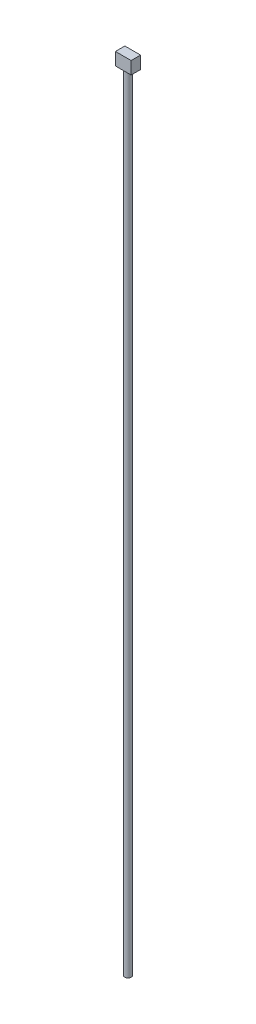
ISO-10303-21;
HEADER;
FILE_DESCRIPTION(('STEP AP214'),'2;1');
FILE_NAME('part.step','',(''),(''),'','','');
FILE_SCHEMA(('AUTOMOTIVE_DESIGN { 1 0 10303 214 1 1 1 1 }'));
ENDSEC;
DATA;
#1=APPLICATION_CONTEXT('core data for automotive mechanical design processes');
#2=APPLICATION_PROTOCOL_DEFINITION('international standard','automotive_design',2000,#1);
#3=PRODUCT_CONTEXT('',#1,'mechanical');
#4=PRODUCT('Part','Part','',(#3));
#5=PRODUCT_RELATED_PRODUCT_CATEGORY('part','',(#4));
#6=PRODUCT_DEFINITION_FORMATION('','',#4);
#7=PRODUCT_DEFINITION_CONTEXT('part definition',#1,'design');
#8=PRODUCT_DEFINITION('design','',#6,#7);
#9=PRODUCT_DEFINITION_SHAPE('','',#8);
#10=(LENGTH_UNIT() NAMED_UNIT(*) SI_UNIT(.MILLI.,.METRE.));
#11=(NAMED_UNIT(*) PLANE_ANGLE_UNIT() SI_UNIT($,.RADIAN.));
#12=(NAMED_UNIT(*) SI_UNIT($,.STERADIAN.) SOLID_ANGLE_UNIT());
#13=UNCERTAINTY_MEASURE_WITH_UNIT(LENGTH_MEASURE(1.E-05),#10,'distance_accuracy_value','');
#14=(GEOMETRIC_REPRESENTATION_CONTEXT(3) GLOBAL_UNCERTAINTY_ASSIGNED_CONTEXT((#13)) GLOBAL_UNIT_ASSIGNED_CONTEXT((#10,
#11,#12)) REPRESENTATION_CONTEXT('',''));
#15=CARTESIAN_POINT('',(0.,0.,0.));
#16=DIRECTION('',(0.,0.,1.));
#17=DIRECTION('',(1.,0.,0.));
#18=AXIS2_PLACEMENT_3D('',#15,#16,#17);
#19=CARTESIAN_POINT('',(0.,125.,0.));
#20=DIRECTION('',(0.,-1.,0.));
#21=DIRECTION('',(0.,0.,-1.));
#22=AXIS2_PLACEMENT_3D('',#19,#20,#21);
#23=CYLINDRICAL_SURFACE('',#22,0.525);
#24=CARTESIAN_POINT('',(0.,125.,0.));
#25=DIRECTION('',(0.,1.,0.));
#26=DIRECTION('',(0.,0.,1.));
#27=AXIS2_PLACEMENT_3D('',#24,#25,#26);
#28=CIRCLE('',#27,0.525);
#29=CARTESIAN_POINT('',(0.,125.,0.525));
#30=VERTEX_POINT('',#29);
#31=EDGE_CURVE('E11',#30,#30,#28,.T.);
#32=ORIENTED_EDGE('',*,*,#31,.F.);
#33=EDGE_LOOP('',(#32));
#34=FACE_BOUND('',#33,.T.);
#35=CARTESIAN_POINT('',(0.,0.,0.));
#36=DIRECTION('',(0.,1.,0.));
#37=DIRECTION('',(0.,0.,1.));
#38=AXIS2_PLACEMENT_3D('',#35,#36,#37);
#39=CIRCLE('',#38,0.525);
#40=CARTESIAN_POINT('',(0.,0.,0.525));
#41=VERTEX_POINT('',#40);
#42=EDGE_CURVE('E44',#41,#41,#39,.T.);
#43=ORIENTED_EDGE('',*,*,#42,.T.);
#44=EDGE_LOOP('',(#43));
#45=FACE_BOUND('',#44,.T.);
#46=ADVANCED_FACE('F41',(#34,#45),#23,.T.);
#47=CARTESIAN_POINT('',(0.,0.,0.));
#48=DIRECTION('',(0.,1.,0.));
#49=DIRECTION('',(0.,0.,1.));
#50=AXIS2_PLACEMENT_3D('',#47,#48,#49);
#51=PLANE('',#50);
#52=ORIENTED_EDGE('',*,*,#42,.F.);
#53=EDGE_LOOP('',(#52));
#54=FACE_BOUND('',#53,.T.);
#55=ADVANCED_FACE('F133',(#54),#51,.F.);
#56=CARTESIAN_POINT('',(1.25,127.,0.75));
#57=DIRECTION('',(-1.,0.,0.));
#58=DIRECTION('',(0.,0.,1.));
#59=AXIS2_PLACEMENT_3D('',#56,#57,#58);
#60=PLANE('',#59);
#61=DIRECTION('',(0.,0.,-1.));
#62=VECTOR('',#61,1.);
#63=CARTESIAN_POINT('',(1.25,125.,0.75));
#64=LINE('',#63,#62);
#65=CARTESIAN_POINT('',(1.25,125.,0.75));
#66=VERTEX_POINT('',#65);
#67=CARTESIAN_POINT('',(1.25,125.,-0.75));
#68=VERTEX_POINT('',#67);
#69=EDGE_CURVE('E113',#66,#68,#64,.T.);
#70=ORIENTED_EDGE('',*,*,#69,.T.);
#71=DIRECTION('',(0.,-1.,0.));
#72=VECTOR('',#71,1.);
#73=CARTESIAN_POINT('',(1.25,127.,-0.75));
#74=LINE('',#73,#72);
#75=CARTESIAN_POINT('',(1.25,127.,-0.75));
#76=VERTEX_POINT('',#75);
#77=EDGE_CURVE('E102',#76,#68,#74,.T.);
#78=ORIENTED_EDGE('',*,*,#77,.F.);
#79=DIRECTION('',(0.,0.,-1.));
#80=VECTOR('',#79,1.);
#81=CARTESIAN_POINT('',(1.25,127.,0.75));
#82=LINE('',#81,#80);
#83=CARTESIAN_POINT('',(1.25,127.,0.75));
#84=VERTEX_POINT('',#83);
#85=EDGE_CURVE('E94',#84,#76,#82,.T.);
#86=ORIENTED_EDGE('',*,*,#85,.F.);
#87=DIRECTION('',(0.,-1.,0.));
#88=VECTOR('',#87,1.);
#89=CARTESIAN_POINT('',(1.25,127.,0.75));
#90=LINE('',#89,#88);
#91=EDGE_CURVE('E109',#84,#66,#90,.T.);
#92=ORIENTED_EDGE('',*,*,#91,.T.);
#93=EDGE_LOOP('',(#70,#78,#86,#92));
#94=FACE_BOUND('',#93,.T.);
#95=ADVANCED_FACE('F135',(#94),#60,.F.);
#96=CARTESIAN_POINT('',(-1.25,127.,-0.75));
#97=DIRECTION('',(0.,0.,1.));
#98=DIRECTION('',(1.,0.,0.));
#99=AXIS2_PLACEMENT_3D('',#96,#97,#98);
#100=PLANE('',#99);
#101=DIRECTION('',(-1.,0.,0.));
#102=VECTOR('',#101,1.);
#103=CARTESIAN_POINT('',(-1.25,125.,-0.75));
#104=LINE('',#103,#102);
#105=CARTESIAN_POINT('',(-1.25,125.,-0.75));
#106=VERTEX_POINT('',#105);
#107=EDGE_CURVE('E100',#68,#106,#104,.T.);
#108=ORIENTED_EDGE('',*,*,#107,.T.);
#109=DIRECTION('',(0.,-1.,0.));
#110=VECTOR('',#109,1.);
#111=CARTESIAN_POINT('',(-1.25,127.,-0.75));
#112=LINE('',#111,#110);
#113=CARTESIAN_POINT('',(-1.25,127.,-0.75));
#114=VERTEX_POINT('',#113);
#115=EDGE_CURVE('E98',#114,#106,#112,.T.);
#116=ORIENTED_EDGE('',*,*,#115,.F.);
#117=DIRECTION('',(-1.,0.,0.));
#118=VECTOR('',#117,1.);
#119=CARTESIAN_POINT('',(-1.25,127.,-0.75));
#120=LINE('',#119,#118);
#121=EDGE_CURVE('E89',#76,#114,#120,.T.);
#122=ORIENTED_EDGE('',*,*,#121,.F.);
#123=ORIENTED_EDGE('',*,*,#77,.T.);
#124=EDGE_LOOP('',(#108,#116,#122,#123));
#125=FACE_BOUND('',#124,.T.);
#126=ADVANCED_FACE('F99',(#125),#100,.F.);
#127=CARTESIAN_POINT('',(-1.25,127.,0.75));
#128=DIRECTION('',(1.,0.,0.));
#129=DIRECTION('',(0.,0.,-1.));
#130=AXIS2_PLACEMENT_3D('',#127,#128,#129);
#131=PLANE('',#130);
#132=DIRECTION('',(0.,0.,1.));
#133=VECTOR('',#132,1.);
#134=CARTESIAN_POINT('',(-1.25,125.,0.75));
#135=LINE('',#134,#133);
#136=CARTESIAN_POINT('',(-1.25,125.,0.75));
#137=VERTEX_POINT('',#136);
#138=EDGE_CURVE('E75',#106,#137,#135,.T.);
#139=ORIENTED_EDGE('',*,*,#138,.T.);
#140=DIRECTION('',(0.,-1.,0.));
#141=VECTOR('',#140,1.);
#142=CARTESIAN_POINT('',(-1.25,127.,0.75));
#143=LINE('',#142,#141);
#144=CARTESIAN_POINT('',(-1.25,127.,0.75));
#145=VERTEX_POINT('',#144);
#146=EDGE_CURVE('E103',#145,#137,#143,.T.);
#147=ORIENTED_EDGE('',*,*,#146,.F.);
#148=DIRECTION('',(0.,0.,1.));
#149=VECTOR('',#148,1.);
#150=CARTESIAN_POINT('',(-1.25,127.,0.75));
#151=LINE('',#150,#149);
#152=EDGE_CURVE('E92',#114,#145,#151,.T.);
#153=ORIENTED_EDGE('',*,*,#152,.F.);
#154=ORIENTED_EDGE('',*,*,#115,.T.);
#155=EDGE_LOOP('',(#139,#147,#153,#154));
#156=FACE_BOUND('',#155,.T.);
#157=ADVANCED_FACE('F105',(#156),#131,.F.);
#158=CARTESIAN_POINT('',(-1.25,127.,0.75));
#159=DIRECTION('',(0.,0.,-1.));
#160=DIRECTION('',(-1.,0.,0.));
#161=AXIS2_PLACEMENT_3D('',#158,#159,#160);
#162=PLANE('',#161);
#163=DIRECTION('',(1.,0.,0.));
#164=VECTOR('',#163,1.);
#165=CARTESIAN_POINT('',(-1.25,125.,0.75));
#166=LINE('',#165,#164);
#167=EDGE_CURVE('E81',#137,#66,#166,.T.);
#168=ORIENTED_EDGE('',*,*,#167,.T.);
#169=ORIENTED_EDGE('',*,*,#91,.F.);
#170=DIRECTION('',(1.,0.,0.));
#171=VECTOR('',#170,1.);
#172=CARTESIAN_POINT('',(-1.25,127.,0.75));
#173=LINE('',#172,#171);
#174=EDGE_CURVE('E58',#145,#84,#173,.T.);
#175=ORIENTED_EDGE('',*,*,#174,.F.);
#176=ORIENTED_EDGE('',*,*,#146,.T.);
#177=EDGE_LOOP('',(#168,#169,#175,#176));
#178=FACE_BOUND('',#177,.T.);
#179=ADVANCED_FACE('F148',(#178),#162,.F.);
#180=CARTESIAN_POINT('',(0.,127.,0.));
#181=DIRECTION('',(0.,-1.,0.));
#182=DIRECTION('',(0.,0.,-1.));
#183=AXIS2_PLACEMENT_3D('',#180,#181,#182);
#184=PLANE('',#183);
#185=ORIENTED_EDGE('',*,*,#85,.T.);
#186=ORIENTED_EDGE('',*,*,#121,.T.);
#187=ORIENTED_EDGE('',*,*,#152,.T.);
#188=ORIENTED_EDGE('',*,*,#174,.T.);
#189=EDGE_LOOP('',(#185,#186,#187,#188));
#190=FACE_BOUND('',#189,.T.);
#191=ADVANCED_FACE('F90',(#190),#184,.F.);
#192=CARTESIAN_POINT('',(0.,125.,0.));
#193=DIRECTION('',(0.,-1.,0.));
#194=DIRECTION('',(0.,0.,-1.));
#195=AXIS2_PLACEMENT_3D('',#192,#193,#194);
#196=PLANE('',#195);
#197=ORIENTED_EDGE('',*,*,#31,.T.);
#198=EDGE_LOOP('',(#197));
#199=FACE_BOUND('',#198,.T.);
#200=ORIENTED_EDGE('',*,*,#69,.F.);
#201=ORIENTED_EDGE('',*,*,#167,.F.);
#202=ORIENTED_EDGE('',*,*,#138,.F.);
#203=ORIENTED_EDGE('',*,*,#107,.F.);
#204=EDGE_LOOP('',(#200,#201,#202,#203));
#205=FACE_BOUND('',#204,.T.);
#206=ADVANCED_FACE('F151',(#199,#205),#196,.T.);
#207=CLOSED_SHELL('',(#46,#55,#95,#126,#157,#179,#191,#206));
#208=MANIFOLD_SOLID_BREP('B2',#207);
#209=ADVANCED_BREP_SHAPE_REPRESENTATION('',(#18,#208),#14);
#210=SHAPE_DEFINITION_REPRESENTATION(#9,#209);
ENDSEC;
END-ISO-10303-21;
